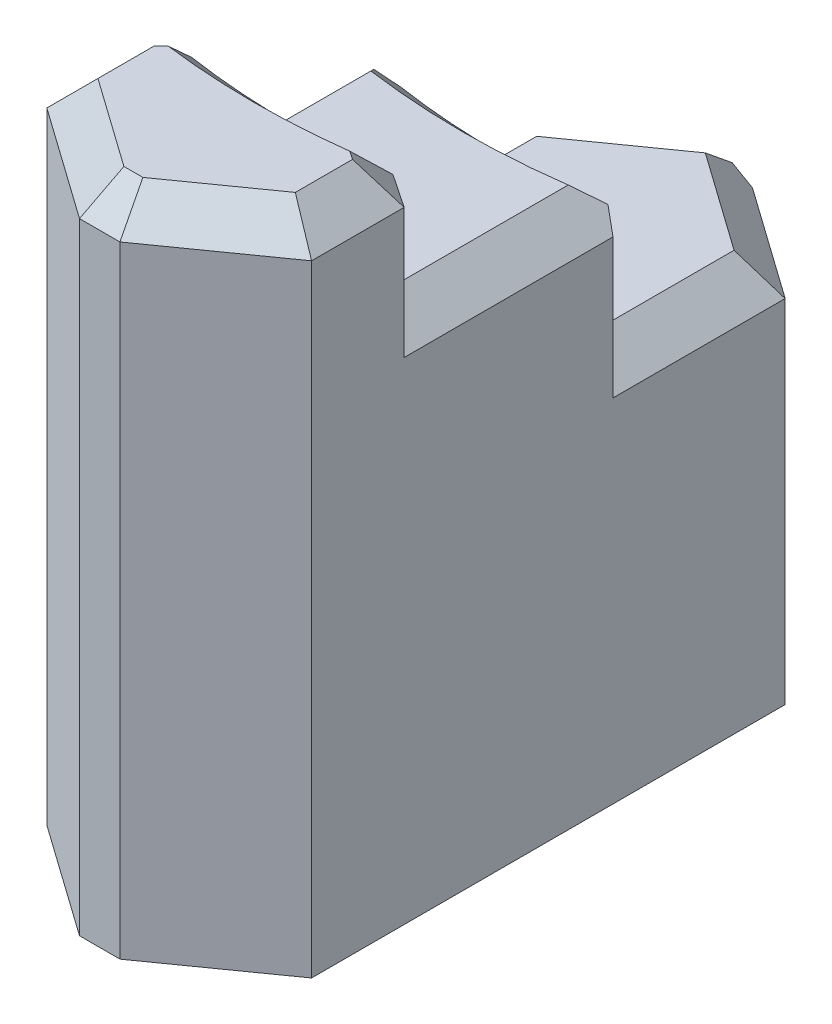
ISO-10303-21;
HEADER;
FILE_DESCRIPTION(('STEP AP214'),'2;1');
FILE_NAME('part.step','',(''),(''),'','','');
FILE_SCHEMA(('AUTOMOTIVE_DESIGN { 1 0 10303 214 1 1 1 1 }'));
ENDSEC;
DATA;
#1=APPLICATION_CONTEXT('core data for automotive mechanical design processes');
#2=APPLICATION_PROTOCOL_DEFINITION('international standard','automotive_design',2000,#1);
#3=PRODUCT_CONTEXT('',#1,'mechanical');
#4=PRODUCT('Part','Part','',(#3));
#5=PRODUCT_RELATED_PRODUCT_CATEGORY('part','',(#4));
#6=PRODUCT_DEFINITION_FORMATION('','',#4);
#7=PRODUCT_DEFINITION_CONTEXT('part definition',#1,'design');
#8=PRODUCT_DEFINITION('design','',#6,#7);
#9=PRODUCT_DEFINITION_SHAPE('','',#8);
#10=(LENGTH_UNIT() NAMED_UNIT(*) SI_UNIT(.MILLI.,.METRE.));
#11=(NAMED_UNIT(*) PLANE_ANGLE_UNIT() SI_UNIT($,.RADIAN.));
#12=(NAMED_UNIT(*) SI_UNIT($,.STERADIAN.) SOLID_ANGLE_UNIT());
#13=UNCERTAINTY_MEASURE_WITH_UNIT(LENGTH_MEASURE(1.E-05),#10,'distance_accuracy_value','');
#14=(GEOMETRIC_REPRESENTATION_CONTEXT(3) GLOBAL_UNCERTAINTY_ASSIGNED_CONTEXT((#13)) GLOBAL_UNIT_ASSIGNED_CONTEXT((#10,
#11,#12)) REPRESENTATION_CONTEXT('',''));
#15=CARTESIAN_POINT('',(0.,0.,0.));
#16=DIRECTION('',(0.,0.,1.));
#17=DIRECTION('',(1.,0.,0.));
#18=AXIS2_PLACEMENT_3D('',#15,#16,#17);
#19=CARTESIAN_POINT('',(9.9822,0.,0.));
#20=DIRECTION('',(0.,0.,-1.));
#21=DIRECTION('',(-1.,0.,0.));
#22=AXIS2_PLACEMENT_3D('',#19,#20,#21);
#23=PLANE('',#22);
#24=DIRECTION('',(0.,1.,0.));
#25=VECTOR('',#24,1.);
#26=CARTESIAN_POINT('',(5.7531,0.,0.));
#27=LINE('',#26,#25);
#28=CARTESIAN_POINT('',(5.7531,0.,0.));
#29=VERTEX_POINT('',#28);
#30=CARTESIAN_POINT('',(5.7531,23.4188,0.));
#31=VERTEX_POINT('',#30);
#32=EDGE_CURVE('E525',#29,#31,#27,.T.);
#33=ORIENTED_EDGE('',*,*,#32,.T.);
#34=DIRECTION('',(-1.,0.,0.));
#35=VECTOR('',#34,1.);
#36=CARTESIAN_POINT('',(9.9822,23.4188,0.));
#37=LINE('',#36,#35);
#38=CARTESIAN_POINT('',(4.2291,23.4188,0.));
#39=VERTEX_POINT('',#38);
#40=EDGE_CURVE('E309',#31,#39,#37,.T.);
#41=ORIENTED_EDGE('',*,*,#40,.T.);
#42=DIRECTION('',(0.,1.,0.));
#43=VECTOR('',#42,1.);
#44=CARTESIAN_POINT('',(4.2291,0.,0.));
#45=LINE('',#44,#43);
#46=CARTESIAN_POINT('',(4.2291,0.,0.));
#47=VERTEX_POINT('',#46);
#48=EDGE_CURVE('E259',#47,#39,#45,.T.);
#49=ORIENTED_EDGE('',*,*,#48,.F.);
#50=DIRECTION('',(-1.,0.,0.));
#51=VECTOR('',#50,1.);
#52=CARTESIAN_POINT('',(9.9822,0.,0.));
#53=LINE('',#52,#51);
#54=EDGE_CURVE('E252',#29,#47,#53,.T.);
#55=ORIENTED_EDGE('',*,*,#54,.F.);
#56=EDGE_LOOP('',(#33,#41,#49,#55));
#57=FACE_BOUND('',#56,.T.);
#58=ADVANCED_FACE('F36',(#57),#23,.F.);
#59=CARTESIAN_POINT('',(9.9822,0.,0.));
#60=DIRECTION('',(0.,1.,0.));
#61=DIRECTION('',(0.,0.,1.));
#62=AXIS2_PLACEMENT_3D('',#59,#60,#61);
#63=PLANE('',#62);
#64=DIRECTION('',(-1.,0.,0.));
#65=VECTOR('',#64,1.);
#66=CARTESIAN_POINT('',(9.9822,0.,-23.8506));
#67=LINE('',#66,#65);
#68=CARTESIAN_POINT('',(5.7531,0.,-23.8506));
#69=VERTEX_POINT('',#68);
#70=CARTESIAN_POINT('',(4.2291,0.,-23.8506));
#71=VERTEX_POINT('',#70);
#72=EDGE_CURVE('E241',#69,#71,#67,.T.);
#73=ORIENTED_EDGE('',*,*,#72,.F.);
#74=DIRECTION('',(0.815879999439261,0.,0.57822126086386));
#75=VECTOR('',#74,1.);
#76=CARTESIAN_POINT('',(5.7531,0.,-23.8506));
#77=LINE('',#76,#75);
#78=CARTESIAN_POINT('',(9.9822,0.,-20.8534));
#79=VERTEX_POINT('',#78);
#80=EDGE_CURVE('E224',#69,#79,#77,.T.);
#81=ORIENTED_EDGE('',*,*,#80,.T.);
#82=DIRECTION('',(0.,0.,-1.));
#83=VECTOR('',#82,1.);
#84=CARTESIAN_POINT('',(9.9822,0.,0.));
#85=LINE('',#84,#83);
#86=CARTESIAN_POINT('',(9.9822,0.,-2.9972));
#87=VERTEX_POINT('',#86);
#88=EDGE_CURVE('E239',#87,#79,#85,.T.);
#89=ORIENTED_EDGE('',*,*,#88,.F.);
#90=DIRECTION('',(-0.81587999943926,0.,0.57822126086386));
#91=VECTOR('',#90,1.);
#92=CARTESIAN_POINT('',(9.9822,0.,-2.9972));
#93=LINE('',#92,#91);
#94=EDGE_CURVE('E514',#87,#29,#93,.T.);
#95=ORIENTED_EDGE('',*,*,#94,.T.);
#96=ORIENTED_EDGE('',*,*,#54,.T.);
#97=DIRECTION('',(-0.81587999943926,0.,-0.57822126086386));
#98=VECTOR('',#97,1.);
#99=CARTESIAN_POINT('',(0.,0.,-2.9972));
#100=LINE('',#99,#98);
#101=CARTESIAN_POINT('',(0.,0.,-2.9972));
#102=VERTEX_POINT('',#101);
#103=EDGE_CURVE('E527',#47,#102,#100,.T.);
#104=ORIENTED_EDGE('',*,*,#103,.T.);
#105=DIRECTION('',(0.,0.,-1.));
#106=VECTOR('',#105,1.);
#107=CARTESIAN_POINT('',(0.,0.,0.));
#108=LINE('',#107,#106);
#109=CARTESIAN_POINT('',(0.,0.,-20.8534));
#110=VERTEX_POINT('',#109);
#111=EDGE_CURVE('E249',#102,#110,#108,.T.);
#112=ORIENTED_EDGE('',*,*,#111,.T.);
#113=DIRECTION('',(0.815879999439261,0.,-0.57822126086386));
#114=VECTOR('',#113,1.);
#115=CARTESIAN_POINT('',(4.2291,0.,-23.8506));
#116=LINE('',#115,#114);
#117=EDGE_CURVE('E517',#110,#71,#116,.T.);
#118=ORIENTED_EDGE('',*,*,#117,.T.);
#119=EDGE_LOOP('',(#73,#81,#89,#95,#96,#104,#112,#118));
#120=FACE_BOUND('',#119,.T.);
#121=ADVANCED_FACE('F237',(#120),#63,.F.);
#122=CARTESIAN_POINT('',(9.9822,0.,-23.8506));
#123=DIRECTION('',(0.,0.,1.));
#124=DIRECTION('',(1.,0.,0.));
#125=AXIS2_PLACEMENT_3D('',#122,#123,#124);
#126=PLANE('',#125);
#127=DIRECTION('',(0.,1.,0.));
#128=VECTOR('',#127,1.);
#129=CARTESIAN_POINT('',(4.2291,0.,-23.8506));
#130=LINE('',#129,#128);
#131=CARTESIAN_POINT('',(4.2291,13.2588,-23.8506));
#132=VERTEX_POINT('',#131);
#133=EDGE_CURVE('E512',#71,#132,#130,.T.);
#134=ORIENTED_EDGE('',*,*,#133,.T.);
#135=DIRECTION('',(-0.865698720476332,-0.500565405682057,0.));
#136=VECTOR('',#135,1.);
#137=CARTESIAN_POINT('',(5.22736411660087,13.8360175361761,-23.8506));
#138=LINE('',#137,#136);
#139=CARTESIAN_POINT('',(4.99110000000001,13.6994046007783,-23.8506));
#140=VERTEX_POINT('',#139);
#141=EDGE_CURVE('E45',#132,#140,#138,.F.);
#142=ORIENTED_EDGE('',*,*,#141,.T.);
#143=DIRECTION('',(-0.865698720476332,0.500565405682056,0.));
#144=VECTOR('',#143,1.);
#145=CARTESIAN_POINT('',(9.73464151590934,10.9565880444891,-23.8506));
#146=LINE('',#145,#144);
#147=CARTESIAN_POINT('',(5.7531,13.2588,-23.8506));
#148=VERTEX_POINT('',#147);
#149=EDGE_CURVE('E488',#140,#148,#146,.F.);
#150=ORIENTED_EDGE('',*,*,#149,.T.);
#151=DIRECTION('',(0.,1.,0.));
#152=VECTOR('',#151,1.);
#153=CARTESIAN_POINT('',(5.7531,0.,-23.8506));
#154=LINE('',#153,#152);
#155=EDGE_CURVE('E232',#69,#148,#154,.T.);
#156=ORIENTED_EDGE('',*,*,#155,.F.);
#157=ORIENTED_EDGE('',*,*,#72,.T.);
#158=EDGE_LOOP('',(#134,#142,#150,#156,#157));
#159=FACE_BOUND('',#158,.T.);
#160=ADVANCED_FACE('F594',(#159),#126,.F.);
#161=CARTESIAN_POINT('',(9.9822,14.5288,-15.4432));
#162=DIRECTION('',(0.,-1.,0.));
#163=DIRECTION('',(0.,0.,-1.));
#164=AXIS2_PLACEMENT_3D('',#161,#162,#163);
#165=PLANE('',#164);
#166=DIRECTION('',(-0.815879999439261,0.,-0.57822126086386));
#167=VECTOR('',#166,1.);
#168=CARTESIAN_POINT('',(11.8001704168978,14.5288,-18.0083870713007));
#169=LINE('',#168,#167);
#170=CARTESIAN_POINT('',(8.71219999999999,14.5288,-20.1968585979911));
#171=VERTEX_POINT('',#170);
#172=CARTESIAN_POINT('',(4.99110000000001,14.5288,-22.834034573967));
#173=VERTEX_POINT('',#172);
#174=EDGE_CURVE('E368',#171,#173,#169,.T.);
#175=ORIENTED_EDGE('',*,*,#174,.T.);
#176=DIRECTION('',(-0.815879999439261,0.,0.57822126086386));
#177=VECTOR('',#176,1.);
#178=CARTESIAN_POINT('',(4.82678256686424,14.5288,-22.7175813781111));
#179=LINE('',#178,#177);
#180=CARTESIAN_POINT('',(1.27,14.5288,-20.1968585979911));
#181=VERTEX_POINT('',#180);
#182=EDGE_CURVE('E497',#173,#181,#179,.T.);
#183=ORIENTED_EDGE('',*,*,#182,.T.);
#184=DIRECTION('',(0.,0.,1.));
#185=VECTOR('',#184,1.);
#186=CARTESIAN_POINT('',(1.27,14.5288,-14.1732));
#187=LINE('',#186,#185);
#188=CARTESIAN_POINT('',(1.27,14.5288,-15.2263209160835));
#189=VERTEX_POINT('',#188);
#190=EDGE_CURVE('E334',#181,#189,#187,.T.);
#191=ORIENTED_EDGE('',*,*,#190,.T.);
#192=CARTESIAN_POINT('',(4.9911,14.5288,-40.8432));
#193=DIRECTION('',(0.,-1.,0.));
#194=DIRECTION('',(0.,0.,-1.));
#195=AXIS2_PLACEMENT_3D('',#192,#193,#194);
#196=CIRCLE('',#195,25.8857311894024);
#197=CARTESIAN_POINT('',(8.69751583986241,14.5288,-15.2241921965737));
#198=VERTEX_POINT('',#197);
#199=EDGE_CURVE('E412',#189,#198,#196,.F.);
#200=ORIENTED_EDGE('',*,*,#199,.T.);
#201=DIRECTION('',(-0.830177549959121,0.,-0.557499090173134));
#202=VECTOR('',#201,1.);
#203=CARTESIAN_POINT('',(9.48155153829823,14.5288,-14.6976792975405));
#204=LINE('',#203,#202);
#205=CARTESIAN_POINT('',(8.71219999999999,14.5288,-15.2143311663434));
#206=VERTEX_POINT('',#205);
#207=EDGE_CURVE('E283',#198,#206,#204,.F.);
#208=ORIENTED_EDGE('',*,*,#207,.T.);
#209=DIRECTION('',(0.,0.,-1.));
#210=VECTOR('',#209,1.);
#211=CARTESIAN_POINT('',(8.71219999999999,14.5288,-15.4432));
#212=LINE('',#211,#210);
#213=EDGE_CURVE('E337',#206,#171,#212,.T.);
#214=ORIENTED_EDGE('',*,*,#213,.T.);
#215=EDGE_LOOP('',(#175,#183,#191,#200,#208,#214));
#216=FACE_BOUND('',#215,.T.);
#217=ADVANCED_FACE('F496',(#216),#165,.F.);
#218=CARTESIAN_POINT('',(9.9822,19.7866,-7.5692));
#219=DIRECTION('',(0.,-1.,0.));
#220=DIRECTION('',(0.,0.,-1.));
#221=AXIS2_PLACEMENT_3D('',#218,#219,#220);
#222=PLANE('',#221);
#223=DIRECTION('',(0.,0.,-1.));
#224=VECTOR('',#223,1.);
#225=CARTESIAN_POINT('',(8.7122,19.7866,-7.5692));
#226=LINE('',#225,#224);
#227=CARTESIAN_POINT('',(8.7122,19.7866,-7.3403311663434));
#228=VERTEX_POINT('',#227);
#229=CARTESIAN_POINT('',(8.7122,19.7866,-13.9436247018455));
#230=VERTEX_POINT('',#229);
#231=EDGE_CURVE('E340',#228,#230,#226,.T.);
#232=ORIENTED_EDGE('',*,*,#231,.T.);
#233=CARTESIAN_POINT('',(4.9911,19.7866,-40.8432));
#234=DIRECTION('',(0.,-1.,0.));
#235=DIRECTION('',(0.,0.,-1.));
#236=AXIS2_PLACEMENT_3D('',#233,#234,#235);
#237=CIRCLE('',#236,27.1557311894024);
#238=CARTESIAN_POINT('',(1.27,19.7866,-13.9436247018455));
#239=VERTEX_POINT('',#238);
#240=EDGE_CURVE('E445',#230,#239,#237,.T.);
#241=ORIENTED_EDGE('',*,*,#240,.T.);
#242=DIRECTION('',(0.,0.,1.));
#243=VECTOR('',#242,1.);
#244=CARTESIAN_POINT('',(1.27,19.7866,-6.29920000000001));
#245=LINE('',#244,#243);
#246=CARTESIAN_POINT('',(1.27,19.7866,-7.35232091608347));
#247=VERTEX_POINT('',#246);
#248=EDGE_CURVE('E343',#239,#247,#245,.T.);
#249=ORIENTED_EDGE('',*,*,#248,.T.);
#250=CARTESIAN_POINT('',(4.9911,19.7866,-32.9692));
#251=DIRECTION('',(0.,-1.,0.));
#252=DIRECTION('',(0.,0.,-1.));
#253=AXIS2_PLACEMENT_3D('',#250,#251,#252);
#254=CIRCLE('',#253,25.8857311894024);
#255=CARTESIAN_POINT('',(8.6975158398624,19.7866,-7.3501921965737));
#256=VERTEX_POINT('',#255);
#257=EDGE_CURVE('E242',#247,#256,#254,.F.);
#258=ORIENTED_EDGE('',*,*,#257,.T.);
#259=DIRECTION('',(-0.830177549959124,0.,-0.557499090173129));
#260=VECTOR('',#259,1.);
#261=CARTESIAN_POINT('',(9.48155153829823,19.7866,-6.82367929754054));
#262=LINE('',#261,#260);
#263=EDGE_CURVE('E286',#256,#228,#262,.F.);
#264=ORIENTED_EDGE('',*,*,#263,.T.);
#265=EDGE_LOOP('',(#232,#241,#249,#258,#264));
#266=FACE_BOUND('',#265,.T.);
#267=ADVANCED_FACE('F603',(#266),#222,.F.);
#268=CARTESIAN_POINT('',(9.9822,24.6888,0.));
#269=DIRECTION('',(0.,-1.,0.));
#270=DIRECTION('',(0.,0.,-1.));
#271=AXIS2_PLACEMENT_3D('',#268,#269,#270);
#272=PLANE('',#271);
#273=DIRECTION('',(1.,0.,0.));
#274=VECTOR('',#273,1.);
#275=CARTESIAN_POINT('',(9.9822,24.6888,-1.27));
#276=LINE('',#275,#274);
#277=CARTESIAN_POINT('',(4.63349952063125,24.6888,-1.27));
#278=VERTEX_POINT('',#277);
#279=CARTESIAN_POINT('',(5.34870047936876,24.6888,-1.27));
#280=VERTEX_POINT('',#279);
#281=EDGE_CURVE('E304',#278,#280,#276,.T.);
#282=ORIENTED_EDGE('',*,*,#281,.T.);
#283=DIRECTION('',(0.815879999439261,0.,-0.57822126086386));
#284=VECTOR('',#283,1.);
#285=CARTESIAN_POINT('',(7.83390243838835,24.6888,-3.03128427125712));
#286=LINE('',#285,#284);
#287=CARTESIAN_POINT('',(8.7122,24.6888,-3.65374140200893));
#288=VERTEX_POINT('',#287);
#289=EDGE_CURVE('E306',#280,#288,#286,.T.);
#290=ORIENTED_EDGE('',*,*,#289,.T.);
#291=DIRECTION('',(0.,0.,-1.));
#292=VECTOR('',#291,1.);
#293=CARTESIAN_POINT('',(8.7122,24.6888,0.));
#294=LINE('',#293,#292);
#295=CARTESIAN_POINT('',(8.7122,24.6888,-5.81053793107399));
#296=VERTEX_POINT('',#295);
#297=EDGE_CURVE('E292',#288,#296,#294,.T.);
#298=ORIENTED_EDGE('',*,*,#297,.T.);
#299=DIRECTION('',(-0.830177549959124,0.,-0.557499090173129));
#300=VECTOR('',#299,1.);
#301=CARTESIAN_POINT('',(7.98949199534252,24.6888,-6.29586670812562));
#302=LINE('',#301,#300);
#303=CARTESIAN_POINT('',(8.38986408936308,24.6888,-6.02700003236673));
#304=VERTEX_POINT('',#303);
#305=EDGE_CURVE('E294',#296,#304,#302,.T.);
#306=ORIENTED_EDGE('',*,*,#305,.T.);
#307=CARTESIAN_POINT('',(4.9911,24.6888,-32.9692));
#308=DIRECTION('',(0.,-1.,0.));
#309=DIRECTION('',(0.,0.,-1.));
#310=AXIS2_PLACEMENT_3D('',#307,#308,#309);
#311=CIRCLE('',#310,27.1557311894024);
#312=CARTESIAN_POINT('',(1.53158464446016,24.6888,-6.03473342024635));
#313=VERTEX_POINT('',#312);
#314=EDGE_CURVE('E296',#304,#313,#311,.T.);
#315=ORIENTED_EDGE('',*,*,#314,.T.);
#316=DIRECTION('',(-0.707106781186546,0.,0.707106781186549));
#317=VECTOR('',#316,1.);
#318=CARTESIAN_POINT('',(0.898025612106918,24.6888,-5.40117438789309));
#319=LINE('',#318,#317);
#320=CARTESIAN_POINT('',(1.27,24.6888,-5.77314877578618));
#321=VERTEX_POINT('',#320);
#322=EDGE_CURVE('E298',#313,#321,#319,.T.);
#323=ORIENTED_EDGE('',*,*,#322,.T.);
#324=DIRECTION('',(0.,0.,1.));
#325=VECTOR('',#324,1.);
#326=CARTESIAN_POINT('',(1.27,24.6888,-2.9972));
#327=LINE('',#326,#325);
#328=CARTESIAN_POINT('',(1.27,24.6888,-3.65374140200893));
#329=VERTEX_POINT('',#328);
#330=EDGE_CURVE('E300',#321,#329,#327,.T.);
#331=ORIENTED_EDGE('',*,*,#330,.T.);
#332=DIRECTION('',(0.81587999943926,0.,0.57822126086386));
#333=VECTOR('',#332,1.);
#334=CARTESIAN_POINT('',(8.7930505453737,24.6888,1.67791003555321));
#335=LINE('',#334,#333);
#336=EDGE_CURVE('E302',#329,#278,#335,.T.);
#337=ORIENTED_EDGE('',*,*,#336,.T.);
#338=EDGE_LOOP('',(#282,#290,#298,#306,#315,#323,#331,#337));
#339=FACE_BOUND('',#338,.T.);
#340=ADVANCED_FACE('F555',(#339),#272,.F.);
#341=CARTESIAN_POINT('',(9.9822,24.6888,0.));
#342=DIRECTION('',(-1.,0.,0.));
#343=DIRECTION('',(0.,0.,1.));
#344=AXIS2_PLACEMENT_3D('',#341,#342,#343);
#345=PLANE('',#344);
#346=DIRECTION('',(0.,1.,0.));
#347=VECTOR('',#346,1.);
#348=CARTESIAN_POINT('',(9.9822,24.6888,-6.48747282952769));
#349=LINE('',#348,#347);
#350=CARTESIAN_POINT('',(9.9822,18.5166,-6.48747282952769));
#351=VERTEX_POINT('',#350);
#352=CARTESIAN_POINT('',(9.9822,23.4188,-6.48747282952769));
#353=VERTEX_POINT('',#352);
#354=EDGE_CURVE('E272',#351,#353,#349,.T.);
#355=ORIENTED_EDGE('',*,*,#354,.T.);
#356=DIRECTION('',(0.,0.,1.));
#357=VECTOR('',#356,1.);
#358=CARTESIAN_POINT('',(9.9822,23.4188,0.));
#359=LINE('',#358,#357);
#360=CARTESIAN_POINT('',(9.9822,23.4188,-2.9972));
#361=VERTEX_POINT('',#360);
#362=EDGE_CURVE('E332',#353,#361,#359,.T.);
#363=ORIENTED_EDGE('',*,*,#362,.T.);
#364=DIRECTION('',(0.,1.,0.));
#365=VECTOR('',#364,1.);
#366=CARTESIAN_POINT('',(9.9822,0.,-2.9972));
#367=LINE('',#366,#365);
#368=EDGE_CURVE('E248',#87,#361,#367,.T.);
#369=ORIENTED_EDGE('',*,*,#368,.F.);
#370=ORIENTED_EDGE('',*,*,#88,.T.);
#371=DIRECTION('',(0.,1.,0.));
#372=VECTOR('',#371,1.);
#373=CARTESIAN_POINT('',(9.9822,0.,-20.8534));
#374=LINE('',#373,#372);
#375=CARTESIAN_POINT('',(9.9822,13.2588,-20.8534));
#376=VERTEX_POINT('',#375);
#377=EDGE_CURVE('E220',#79,#376,#374,.T.);
#378=ORIENTED_EDGE('',*,*,#377,.T.);
#379=DIRECTION('',(0.,0.,1.));
#380=VECTOR('',#379,1.);
#381=CARTESIAN_POINT('',(9.9822,13.2588,0.));
#382=LINE('',#381,#380);
#383=CARTESIAN_POINT('',(9.9822,13.2588,-14.3614728295277));
#384=VERTEX_POINT('',#383);
#385=EDGE_CURVE('E330',#376,#384,#382,.T.);
#386=ORIENTED_EDGE('',*,*,#385,.T.);
#387=DIRECTION('',(0.,1.,0.));
#388=VECTOR('',#387,1.);
#389=CARTESIAN_POINT('',(9.9822,24.6888,-14.3614728295277));
#390=LINE('',#389,#388);
#391=CARTESIAN_POINT('',(9.9822,18.5166,-14.3614728295277));
#392=VERTEX_POINT('',#391);
#393=EDGE_CURVE('E274',#384,#392,#390,.T.);
#394=ORIENTED_EDGE('',*,*,#393,.T.);
#395=DIRECTION('',(0.,0.,1.));
#396=VECTOR('',#395,1.);
#397=CARTESIAN_POINT('',(9.9822,18.5166,0.));
#398=LINE('',#397,#396);
#399=EDGE_CURVE('E327',#392,#351,#398,.T.);
#400=ORIENTED_EDGE('',*,*,#399,.T.);
#401=EDGE_LOOP('',(#355,#363,#369,#370,#378,#386,#394,#400));
#402=FACE_BOUND('',#401,.T.);
#403=ADVANCED_FACE('F246',(#402),#345,.F.);
#404=CARTESIAN_POINT('',(0.,24.6888,0.));
#405=DIRECTION('',(-1.,0.,0.));
#406=DIRECTION('',(0.,0.,1.));
#407=AXIS2_PLACEMENT_3D('',#404,#405,#406);
#408=PLANE('',#407);
#409=DIRECTION('',(0.,1.,0.));
#410=VECTOR('',#409,1.);
#411=CARTESIAN_POINT('',(0.,0.,-2.9972));
#412=LINE('',#411,#410);
#413=CARTESIAN_POINT('',(0.,23.4188,-2.9972));
#414=VERTEX_POINT('',#413);
#415=EDGE_CURVE('E256',#102,#414,#412,.T.);
#416=ORIENTED_EDGE('',*,*,#415,.T.);
#417=DIRECTION('',(0.,0.,-1.));
#418=VECTOR('',#417,1.);
#419=CARTESIAN_POINT('',(0.,23.4188,-6.29920000000001));
#420=LINE('',#419,#418);
#421=CARTESIAN_POINT('',(0.,23.4188,-6.29920000000001));
#422=VERTEX_POINT('',#421);
#423=EDGE_CURVE('E319',#414,#422,#420,.T.);
#424=ORIENTED_EDGE('',*,*,#423,.T.);
#425=DIRECTION('',(0.,-1.,0.));
#426=VECTOR('',#425,1.);
#427=CARTESIAN_POINT('',(0.,19.7866,-6.29920000000001));
#428=LINE('',#427,#426);
#429=CARTESIAN_POINT('',(0.,18.5166,-6.29920000000001));
#430=VERTEX_POINT('',#429);
#431=EDGE_CURVE('E268',#422,#430,#428,.T.);
#432=ORIENTED_EDGE('',*,*,#431,.T.);
#433=DIRECTION('',(0.,0.,-1.));
#434=VECTOR('',#433,1.);
#435=CARTESIAN_POINT('',(0.,18.5166,-14.1732));
#436=LINE('',#435,#434);
#437=CARTESIAN_POINT('',(0.,18.5166,-14.1732));
#438=VERTEX_POINT('',#437);
#439=EDGE_CURVE('E313',#430,#438,#436,.T.);
#440=ORIENTED_EDGE('',*,*,#439,.T.);
#441=DIRECTION('',(0.,-1.,0.));
#442=VECTOR('',#441,1.);
#443=CARTESIAN_POINT('',(0.,14.5288,-14.1732));
#444=LINE('',#443,#442);
#445=CARTESIAN_POINT('',(0.,13.2588,-14.1732));
#446=VERTEX_POINT('',#445);
#447=EDGE_CURVE('E270',#438,#446,#444,.T.);
#448=ORIENTED_EDGE('',*,*,#447,.T.);
#449=DIRECTION('',(0.,0.,-1.));
#450=VECTOR('',#449,1.);
#451=CARTESIAN_POINT('',(0.,13.2588,-20.8534));
#452=LINE('',#451,#450);
#453=CARTESIAN_POINT('',(0.,13.2588,-20.8534));
#454=VERTEX_POINT('',#453);
#455=EDGE_CURVE('E315',#446,#454,#452,.T.);
#456=ORIENTED_EDGE('',*,*,#455,.T.);
#457=DIRECTION('',(0.,1.,0.));
#458=VECTOR('',#457,1.);
#459=CARTESIAN_POINT('',(0.,0.,-20.8534));
#460=LINE('',#459,#458);
#461=EDGE_CURVE('E515',#110,#454,#460,.T.);
#462=ORIENTED_EDGE('',*,*,#461,.F.);
#463=ORIENTED_EDGE('',*,*,#111,.F.);
#464=EDGE_LOOP('',(#416,#424,#432,#440,#448,#456,#462,#463));
#465=FACE_BOUND('',#464,.T.);
#466=ADVANCED_FACE('F578',(#465),#408,.T.);
#467=CARTESIAN_POINT('',(0.,0.,-2.9972));
#468=DIRECTION('',(0.57822126086386,0.,-0.81587999943926));
#469=DIRECTION('',(-0.81587999943926,0.,-0.57822126086386));
#470=AXIS2_PLACEMENT_3D('',#467,#468,#469);
#471=PLANE('',#470);
#472=ORIENTED_EDGE('',*,*,#48,.T.);
#473=DIRECTION('',(-0.81587999943926,0.,-0.57822126086386));
#474=VECTOR('',#473,1.);
#475=CARTESIAN_POINT('',(0.,23.4188,-2.9972));
#476=LINE('',#475,#474);
#477=EDGE_CURVE('E311',#39,#414,#476,.T.);
#478=ORIENTED_EDGE('',*,*,#477,.T.);
#479=ORIENTED_EDGE('',*,*,#415,.F.);
#480=ORIENTED_EDGE('',*,*,#103,.F.);
#481=EDGE_LOOP('',(#472,#478,#479,#480));
#482=FACE_BOUND('',#481,.T.);
#483=ADVANCED_FACE('F540',(#482),#471,.F.);
#484=CARTESIAN_POINT('',(9.9822,0.,-2.9972));
#485=DIRECTION('',(-0.57822126086386,0.,-0.81587999943926));
#486=DIRECTION('',(-0.815879999439261,0.,0.57822126086386));
#487=AXIS2_PLACEMENT_3D('',#484,#485,#486);
#488=PLANE('',#487);
#489=ORIENTED_EDGE('',*,*,#368,.T.);
#490=DIRECTION('',(-0.815879999439261,0.,0.57822126086386));
#491=VECTOR('',#490,1.);
#492=CARTESIAN_POINT('',(9.9822,23.4188,-2.9972));
#493=LINE('',#492,#491);
#494=EDGE_CURVE('E289',#361,#31,#493,.T.);
#495=ORIENTED_EDGE('',*,*,#494,.T.);
#496=ORIENTED_EDGE('',*,*,#32,.F.);
#497=ORIENTED_EDGE('',*,*,#94,.F.);
#498=EDGE_LOOP('',(#489,#495,#496,#497));
#499=FACE_BOUND('',#498,.T.);
#500=ADVANCED_FACE('F610',(#499),#488,.F.);
#501=CARTESIAN_POINT('',(4.2291,0.,-23.8506));
#502=DIRECTION('',(0.57822126086386,0.,0.815879999439261));
#503=DIRECTION('',(0.815879999439261,0.,-0.57822126086386));
#504=AXIS2_PLACEMENT_3D('',#501,#502,#503);
#505=PLANE('',#504);
#506=ORIENTED_EDGE('',*,*,#461,.T.);
#507=DIRECTION('',(0.815879999439261,0.,-0.57822126086386));
#508=VECTOR('',#507,1.);
#509=CARTESIAN_POINT('',(4.2291,13.2588,-23.8506));
#510=LINE('',#509,#508);
#511=EDGE_CURVE('E65',#454,#132,#510,.T.);
#512=ORIENTED_EDGE('',*,*,#511,.T.);
#513=ORIENTED_EDGE('',*,*,#133,.F.);
#514=ORIENTED_EDGE('',*,*,#117,.F.);
#515=EDGE_LOOP('',(#506,#512,#513,#514));
#516=FACE_BOUND('',#515,.T.);
#517=ADVANCED_FACE('F593',(#516),#505,.F.);
#518=CARTESIAN_POINT('',(5.7531,0.,-23.8506));
#519=DIRECTION('',(-0.57822126086386,0.,0.815879999439261));
#520=DIRECTION('',(0.815879999439261,0.,0.57822126086386));
#521=AXIS2_PLACEMENT_3D('',#518,#519,#520);
#522=PLANE('',#521);
#523=ORIENTED_EDGE('',*,*,#155,.T.);
#524=DIRECTION('',(0.815879999439261,0.,0.57822126086386));
#525=VECTOR('',#524,1.);
#526=CARTESIAN_POINT('',(5.7531,13.2588,-23.8506));
#527=LINE('',#526,#525);
#528=EDGE_CURVE('E227',#148,#376,#527,.T.);
#529=ORIENTED_EDGE('',*,*,#528,.T.);
#530=ORIENTED_EDGE('',*,*,#377,.F.);
#531=ORIENTED_EDGE('',*,*,#80,.F.);
#532=EDGE_LOOP('',(#523,#529,#530,#531));
#533=FACE_BOUND('',#532,.T.);
#534=ADVANCED_FACE('F223',(#533),#522,.F.);
#535=CARTESIAN_POINT('',(4.9911,-53.4293042399942,-32.9692));
#536=DIRECTION('',(0.,1.,0.));
#537=DIRECTION('',(0.,0.,1.));
#538=AXIS2_PLACEMENT_3D('',#535,#536,#537);
#539=CYLINDRICAL_SURFACE('',#538,25.8857311894024);
#540=DIRECTION('',(0.,1.,0.));
#541=VECTOR('',#540,1.);
#542=CARTESIAN_POINT('',(1.08124956565735,-53.4293042399942,-7.38044956565736));
#543=LINE('',#542,#541);
#544=CARTESIAN_POINT('',(1.08124956565735,19.5978495656573,-7.38044956565736));
#545=VERTEX_POINT('',#544);
#546=CARTESIAN_POINT('',(1.08124956565735,23.4188,-7.38044956565736));
#547=VERTEX_POINT('',#546);
#548=EDGE_CURVE('E277',#545,#547,#543,.T.);
#549=ORIENTED_EDGE('',*,*,#548,.T.);
#550=CARTESIAN_POINT('',(4.9911,23.4188,-32.9692));
#551=DIRECTION('',(0.,-1.,0.));
#552=DIRECTION('',(0.,0.,-1.));
#553=AXIS2_PLACEMENT_3D('',#550,#551,#552);
#554=CIRCLE('',#553,25.8857311894024);
#555=CARTESIAN_POINT('',(8.6975158398624,23.4188,-7.3501921965737));
#556=VERTEX_POINT('',#555);
#557=EDGE_CURVE('E323',#547,#556,#554,.F.);
#558=ORIENTED_EDGE('',*,*,#557,.T.);
#559=DIRECTION('',(0.,1.,0.));
#560=VECTOR('',#559,1.);
#561=CARTESIAN_POINT('',(8.6975158398624,-53.4293042399942,-7.3501921965737));
#562=LINE('',#561,#560);
#563=EDGE_CURVE('E280',#556,#256,#562,.F.);
#564=ORIENTED_EDGE('',*,*,#563,.T.);
#565=ORIENTED_EDGE('',*,*,#257,.F.);
#566=CARTESIAN_POINT('',(4.9911,23.5077,-32.9692));
#567=DIRECTION('',(-0.707106781186548,0.707106781186547,0.));
#568=DIRECTION('',(0.707106781186547,0.707106781186548,0.));
#569=AXIS2_PLACEMENT_3D('',#566,#567,#568);
#570=ELLIPSE('',#569,36.6079521199972,25.8857311894024);
#571=EDGE_CURVE('E360',#247,#545,#570,.F.);
#572=ORIENTED_EDGE('',*,*,#571,.T.);
#573=EDGE_LOOP('',(#549,#558,#564,#565,#572));
#574=FACE_BOUND('',#573,.T.);
#575=ADVANCED_FACE('F608',(#574),#539,.F.);
#576=CARTESIAN_POINT('',(4.9911,-58.6871042399942,-40.8432));
#577=DIRECTION('',(0.,1.,0.));
#578=DIRECTION('',(0.,0.,1.));
#579=AXIS2_PLACEMENT_3D('',#576,#577,#578);
#580=CYLINDRICAL_SURFACE('',#579,25.8857311894024);
#581=DIRECTION('',(0.,1.,0.));
#582=VECTOR('',#581,1.);
#583=CARTESIAN_POINT('',(1.08124956565735,-58.6871042399942,-15.2544495656574));
#584=LINE('',#583,#582);
#585=CARTESIAN_POINT('',(1.08124956565735,14.3400495656573,-15.2544495656574));
#586=VERTEX_POINT('',#585);
#587=CARTESIAN_POINT('',(1.08124956565735,18.5166,-15.2544495656574));
#588=VERTEX_POINT('',#587);
#589=EDGE_CURVE('E265',#586,#588,#584,.T.);
#590=ORIENTED_EDGE('',*,*,#589,.T.);
#591=CARTESIAN_POINT('',(4.9911,18.5166,-40.8432));
#592=DIRECTION('',(0.,-1.,0.));
#593=DIRECTION('',(0.,0.,-1.));
#594=AXIS2_PLACEMENT_3D('',#591,#592,#593);
#595=CIRCLE('',#594,25.8857311894024);
#596=CARTESIAN_POINT('',(8.69751583986241,18.5166,-15.2241921965737));
#597=VERTEX_POINT('',#596);
#598=EDGE_CURVE('E478',#588,#597,#595,.F.);
#599=ORIENTED_EDGE('',*,*,#598,.T.);
#600=DIRECTION('',(0.,1.,0.));
#601=VECTOR('',#600,1.);
#602=CARTESIAN_POINT('',(8.69751583986241,-58.6871042399942,-15.2241921965737));
#603=LINE('',#602,#601);
#604=EDGE_CURVE('E263',#597,#198,#603,.F.);
#605=ORIENTED_EDGE('',*,*,#604,.T.);
#606=ORIENTED_EDGE('',*,*,#199,.F.);
#607=CARTESIAN_POINT('',(4.9911,18.2499,-40.8432));
#608=DIRECTION('',(-0.707106781186548,0.707106781186547,0.));
#609=DIRECTION('',(0.707106781186547,0.707106781186548,0.));
#610=AXIS2_PLACEMENT_3D('',#607,#608,#609);
#611=ELLIPSE('',#610,36.6079521199972,25.8857311894024);
#612=EDGE_CURVE('E352',#189,#586,#611,.F.);
#613=ORIENTED_EDGE('',*,*,#612,.T.);
#614=EDGE_LOOP('',(#590,#599,#605,#606,#613));
#615=FACE_BOUND('',#614,.T.);
#616=ADVANCED_FACE('F621',(#615),#580,.F.);
#617=CARTESIAN_POINT('',(1.08124956565735,-58.6871042399942,-15.2544495656574));
#618=DIRECTION('',(0.707106781186549,0.,0.707106781186546));
#619=DIRECTION('',(0.707106781186546,0.,-0.707106781186549));
#620=AXIS2_PLACEMENT_3D('',#617,#618,#619);
#621=PLANE('',#620);
#622=DIRECTION('',(-0.577350269189624,-0.577350269189626,0.577350269189627));
#623=VECTOR('',#622,1.);
#624=CARTESIAN_POINT('',(-25.0137350362264,-6.49713503622652,10.8405350362266));
#625=LINE('',#624,#623);
#626=CARTESIAN_POINT('',(0.577463280485097,19.0940632804851,-14.7506632804851));
#627=VERTEX_POINT('',#626);
#628=EDGE_CURVE('E345',#438,#627,#625,.F.);
#629=ORIENTED_EDGE('',*,*,#628,.T.);
#630=CARTESIAN_POINT('',(0.577463280485097,19.0940632804851,-14.7506632804851));
#631=CARTESIAN_POINT('',(0.661235891761203,18.9974848012851,-14.8344358917612));
#632=CARTESIAN_POINT('',(0.745104386908851,18.9010736226948,-14.9183043869089));
#633=CARTESIAN_POINT('',(0.913033148624535,18.7085858625184,-15.0862331486245));
#634=CARTESIAN_POINT('',(0.997093415200969,18.612509280947,-15.170293415201));
#635=CARTESIAN_POINT('',(1.08124956565734,18.5166,-15.2544495656574));
#636=B_SPLINE_CURVE_WITH_KNOTS('',3,(#630,#631,#632,#633,#634,#635),.UNSPECIFIED.,.F.,.F.,(4,2,
4),(0.,0.458548447630694,0.917096915343979),.UNSPECIFIED.);
#637=EDGE_CURVE('E444',#627,#588,#636,.T.);
#638=ORIENTED_EDGE('',*,*,#637,.T.);
#639=ORIENTED_EDGE('',*,*,#589,.F.);
#640=DIRECTION('',(0.577350269189624,0.577350269189626,-0.577350269189627));
#641=VECTOR('',#640,1.);
#642=CARTESIAN_POINT('',(1.27,14.5288,-15.4432));
#643=LINE('',#642,#641);
#644=EDGE_CURVE('E356',#586,#446,#643,.F.);
#645=ORIENTED_EDGE('',*,*,#644,.T.);
#646=ORIENTED_EDGE('',*,*,#447,.F.);
#647=EDGE_LOOP('',(#629,#638,#639,#645,#646));
#648=FACE_BOUND('',#647,.T.);
#649=ADVANCED_FACE('F587',(#648),#621,.F.);
#650=CARTESIAN_POINT('',(9.9822,-58.6871042399942,-14.3614728295277));
#651=DIRECTION('',(-0.557499090173134,0.,0.83017754995912));
#652=DIRECTION('',(0.83017754995912,0.,0.557499090173134));
#653=AXIS2_PLACEMENT_3D('',#650,#651,#652);
#654=PLANE('',#653);
#655=ORIENTED_EDGE('',*,*,#604,.F.);
#656=CARTESIAN_POINT('',(8.69751583986241,18.5166,-15.2241921965737));
#657=CARTESIAN_POINT('',(8.8157392096836,18.6121205330907,-15.1448002386537));
#658=CARTESIAN_POINT('',(8.93372309426424,18.7080656239254,-15.0655691051304));
#659=CARTESIAN_POINT('',(9.16921186963608,18.9008049020061,-14.9074285025301));
#660=CARTESIAN_POINT('',(9.28671676052209,18.9975990890839,-14.8285190333894));
#661=CARTESIAN_POINT('',(9.40398216626236,19.0948178337376,-14.7497703885818));
#662=B_SPLINE_CURVE_WITH_KNOTS('',3,(#656,#657,#658,#659,#660,#661),.UNSPECIFIED.,.F.,.F.,(4,2,
4),(0.,0.514421101781996,1.02884210173083),.UNSPECIFIED.);
#663=CARTESIAN_POINT('',(9.40398216626236,19.0948178337377,-14.7497703885818));
#664=VERTEX_POINT('',#663);
#665=EDGE_CURVE('E461',#597,#664,#662,.T.);
#666=ORIENTED_EDGE('',*,*,#665,.T.);
#667=DIRECTION('',(0.638750306398286,-0.638750306398284,0.428947656657772));
#668=VECTOR('',#667,1.);
#669=CARTESIAN_POINT('',(41.4814621800808,-12.9826621800807,6.79160461442964));
#670=LINE('',#669,#668);
#671=EDGE_CURVE('E348',#664,#392,#670,.T.);
#672=ORIENTED_EDGE('',*,*,#671,.T.);
#673=ORIENTED_EDGE('',*,*,#393,.F.);
#674=DIRECTION('',(-0.638750306398287,0.638750306398283,-0.428947656657772));
#675=VECTOR('',#674,1.);
#676=CARTESIAN_POINT('',(13.9171063618494,9.32389363815066,-11.7190179513447));
#677=LINE('',#676,#675);
#678=EDGE_CURVE('E350',#384,#206,#677,.T.);
#679=ORIENTED_EDGE('',*,*,#678,.T.);
#680=ORIENTED_EDGE('',*,*,#207,.F.);
#681=EDGE_LOOP('',(#655,#666,#672,#673,#679,#680));
#682=FACE_BOUND('',#681,.T.);
#683=ADVANCED_FACE('F620',(#682),#654,.F.);
#684=CARTESIAN_POINT('',(9.9822,-53.4293042399942,-6.48747282952769));
#685=DIRECTION('',(-0.557499090173129,0.,0.830177549959124));
#686=DIRECTION('',(0.830177549959124,0.,0.557499090173129));
#687=AXIS2_PLACEMENT_3D('',#684,#685,#686);
#688=PLANE('',#687);
#689=ORIENTED_EDGE('',*,*,#563,.F.);
#690=DIRECTION('',(-0.830177549959124,0.,-0.557499090173129));
#691=VECTOR('',#690,1.);
#692=CARTESIAN_POINT('',(9.9822,23.4188,-6.48747282952769));
#693=LINE('',#692,#691);
#694=EDGE_CURVE('E325',#556,#353,#693,.F.);
#695=ORIENTED_EDGE('',*,*,#694,.T.);
#696=ORIENTED_EDGE('',*,*,#354,.F.);
#697=DIRECTION('',(-0.638750306398287,0.638750306398286,-0.428947656657768));
#698=VECTOR('',#697,1.);
#699=CARTESIAN_POINT('',(11.7597055812345,16.7390944187655,-5.29380318095109));
#700=LINE('',#699,#698);
#701=EDGE_CURVE('E366',#351,#228,#700,.T.);
#702=ORIENTED_EDGE('',*,*,#701,.T.);
#703=ORIENTED_EDGE('',*,*,#263,.F.);
#704=EDGE_LOOP('',(#689,#695,#696,#702,#703));
#705=FACE_BOUND('',#704,.T.);
#706=ADVANCED_FACE('F601',(#705),#688,.F.);
#707=CARTESIAN_POINT('',(1.08124956565735,-53.4293042399942,-7.38044956565736));
#708=DIRECTION('',(0.707106781186549,0.,0.707106781186546));
#709=DIRECTION('',(0.707106781186546,0.,-0.707106781186549));
#710=AXIS2_PLACEMENT_3D('',#707,#708,#709);
#711=PLANE('',#710);
#712=ORIENTED_EDGE('',*,*,#431,.F.);
#713=DIRECTION('',(-0.707106781186546,0.,0.707106781186549));
#714=VECTOR('',#713,1.);
#715=CARTESIAN_POINT('',(1.08124956565734,23.4188,-7.38044956565736));
#716=LINE('',#715,#714);
#717=EDGE_CURVE('E321',#422,#547,#716,.F.);
#718=ORIENTED_EDGE('',*,*,#717,.T.);
#719=ORIENTED_EDGE('',*,*,#548,.F.);
#720=DIRECTION('',(0.577350269189624,0.577350269189626,-0.577350269189627));
#721=VECTOR('',#720,1.);
#722=CARTESIAN_POINT('',(1.27,19.7866,-7.56920000000001));
#723=LINE('',#722,#721);
#724=EDGE_CURVE('E363',#545,#430,#723,.F.);
#725=ORIENTED_EDGE('',*,*,#724,.T.);
#726=EDGE_LOOP('',(#712,#718,#719,#725));
#727=FACE_BOUND('',#726,.T.);
#728=ADVANCED_FACE('F417',(#727),#711,.F.);
#729=CARTESIAN_POINT('',(2.73952561210689,24.6888,-7.24267438789307));
#730=DIRECTION('',(0.5,-0.707106781186549,0.499999999999998));
#731=DIRECTION('',(0.816496580927726,0.577350269189625,0.));
#732=AXIS2_PLACEMENT_3D('',#729,#730,#731);
#733=PLANE('',#732);
#734=DIRECTION('',(-0.678598344545848,-0.678598344545846,-0.28108463771482));
#735=VECTOR('',#734,1.);
#736=CARTESIAN_POINT('',(1.66640768363207,25.0852076836321,-5.60895133699687));
#737=LINE('',#736,#735);
#738=EDGE_CURVE('E391',#321,#422,#737,.T.);
#739=ORIENTED_EDGE('',*,*,#738,.F.);
#740=ORIENTED_EDGE('',*,*,#322,.F.);
#741=CARTESIAN_POINT('',(1.08124956565735,23.4188,-7.38044956565736));
#742=CARTESIAN_POINT('',(1.15506597518336,23.6301169523908,-7.15541867515297));
#743=CARTESIAN_POINT('',(1.2295021081974,23.8416087758625,-6.93076020308227));
#744=CARTESIAN_POINT('',(1.37961380145772,24.2649421092879,-6.48218815480787));
#745=CARTESIAN_POINT('',(1.45528936137794,24.4767836191495,-6.25827457840823));
#746=CARTESIAN_POINT('',(1.53158464446016,24.6888,-6.03473342024634));
#747=B_SPLINE_CURVE_WITH_KNOTS('',3,(#741,#742,#743,#744,#745,#746),.UNSPECIFIED.,.F.,.F.,(4,2,
4),(0.,0.952191485626512,1.90438272077406),.UNSPECIFIED.);
#748=EDGE_CURVE('E405',#547,#313,#747,.T.);
#749=ORIENTED_EDGE('',*,*,#748,.F.);
#750=ORIENTED_EDGE('',*,*,#717,.F.);
#751=EDGE_LOOP('',(#739,#740,#749,#750));
#752=FACE_BOUND('',#751,.T.);
#753=ADVANCED_FACE('F401',(#752),#733,.F.);
#754=CARTESIAN_POINT('',(4.9911,23.4188,-32.9692));
#755=DIRECTION('',(0.,1.,0.));
#756=DIRECTION('',(0.,0.,1.));
#757=AXIS2_PLACEMENT_3D('',#754,#755,#756);
#758=CONICAL_SURFACE('',#757,25.8857311894024,0.78539816339745);
#759=ORIENTED_EDGE('',*,*,#748,.T.);
#760=ORIENTED_EDGE('',*,*,#314,.F.);
#761=CARTESIAN_POINT('',(8.6975158398624,23.4188,-7.3501921965737));
#762=CARTESIAN_POINT('',(8.6472019592467,23.6302716612743,-7.12924943726033));
#763=CARTESIAN_POINT('',(8.59640737122307,23.8418408327109,-6.90851203616256));
#764=CARTESIAN_POINT('',(8.49385678758778,24.2651741660717,-6.46744798148479));
#765=CARTESIAN_POINT('',(8.44210079211164,24.4769383279685,-6.24712132784691));
#766=CARTESIAN_POINT('',(8.38986408936309,24.6888,-6.02700003236673));
#767=B_SPLINE_CURVE_WITH_KNOTS('',3,(#761,#762,#763,#764,#765,#766),.UNSPECIFIED.,.F.,.F.,(4,2,
4),(0.,0.929838395886234,1.85967666070083),.UNSPECIFIED.);
#768=EDGE_CURVE('E382',#556,#304,#767,.T.);
#769=ORIENTED_EDGE('',*,*,#768,.F.);
#770=ORIENTED_EDGE('',*,*,#557,.F.);
#771=EDGE_LOOP('',(#759,#760,#769,#770));
#772=FACE_BOUND('',#771,.T.);
#773=ADVANCED_FACE('F396',(#772),#758,.F.);
#774=CARTESIAN_POINT('',(1.27,24.6888,0.));
#775=DIRECTION('',(-0.707106781186546,0.707106781186548,0.));
#776=DIRECTION('',(-0.707106781186549,-0.707106781186547,0.));
#777=AXIS2_PLACEMENT_3D('',#774,#775,#776);
#778=PLANE('',#777);
#779=ORIENTED_EDGE('',*,*,#738,.T.);
#780=ORIENTED_EDGE('',*,*,#423,.F.);
#781=DIRECTION('',(-0.664125795155427,-0.664125795155425,0.343327622568221));
#782=VECTOR('',#781,1.);
#783=CARTESIAN_POINT('',(0.436900446982817,23.8557004469828,-3.22306081259876));
#784=LINE('',#783,#782);
#785=EDGE_CURVE('E379',#329,#414,#784,.T.);
#786=ORIENTED_EDGE('',*,*,#785,.F.);
#787=ORIENTED_EDGE('',*,*,#330,.F.);
#788=EDGE_LOOP('',(#779,#780,#786,#787));
#789=FACE_BOUND('',#788,.T.);
#790=ADVANCED_FACE('F400',(#789),#778,.T.);
#791=CARTESIAN_POINT('',(12.276729277093,24.6888,-3.41680682021381));
#792=DIRECTION('',(-0.39421138716675,-0.707106781186549,0.587024175164929));
#793=DIRECTION('',(0.,-0.638750306398285,-0.769414092719971));
#794=AXIS2_PLACEMENT_3D('',#791,#792,#793);
#795=PLANE('',#794);
#796=ORIENTED_EDGE('',*,*,#768,.T.);
#797=ORIENTED_EDGE('',*,*,#305,.F.);
#798=DIRECTION('',(-0.66167008793742,0.661670087937418,0.35268312896675));
#799=VECTOR('',#798,1.);
#800=CARTESIAN_POINT('',(8.46828413873646,24.9327158612635,-5.68052599503014));
#801=LINE('',#800,#799);
#802=EDGE_CURVE('E376',#353,#296,#801,.T.);
#803=ORIENTED_EDGE('',*,*,#802,.F.);
#804=ORIENTED_EDGE('',*,*,#694,.F.);
#805=EDGE_LOOP('',(#796,#797,#803,#804));
#806=FACE_BOUND('',#805,.T.);
#807=ADVANCED_FACE('F393',(#806),#795,.F.);
#808=CARTESIAN_POINT('',(0.,23.4188,-2.9972));
#809=DIRECTION('',(0.408864174583071,-0.707106781186549,-0.576914280237976));
#810=DIRECTION('',(0.,0.632168840981757,-0.774830663107612));
#811=AXIS2_PLACEMENT_3D('',#808,#809,#810);
#812=PLANE('',#811);
#813=ORIENTED_EDGE('',*,*,#785,.T.);
#814=ORIENTED_EDGE('',*,*,#477,.F.);
#815=DIRECTION('',(0.219661087523158,0.689836577251504,-0.689836577251506));
#816=VECTOR('',#815,1.);
#817=CARTESIAN_POINT('',(4.47920819754027,24.2042544693335,-0.785454469333526));
#818=LINE('',#817,#816);
#819=EDGE_CURVE('E373',#278,#39,#818,.F.);
#820=ORIENTED_EDGE('',*,*,#819,.F.);
#821=ORIENTED_EDGE('',*,*,#336,.F.);
#822=EDGE_LOOP('',(#813,#814,#820,#821));
#823=FACE_BOUND('',#822,.T.);
#824=ADVANCED_FACE('F545',(#823),#812,.F.);
#825=CARTESIAN_POINT('',(9.9822,23.4188,0.));
#826=DIRECTION('',(-0.707106781186546,-0.707106781186548,0.));
#827=DIRECTION('',(0.707106781186549,-0.707106781186547,0.));
#828=AXIS2_PLACEMENT_3D('',#825,#826,#827);
#829=PLANE('',#828);
#830=ORIENTED_EDGE('',*,*,#802,.T.);
#831=ORIENTED_EDGE('',*,*,#297,.F.);
#832=DIRECTION('',(0.664125795155427,-0.664125795155425,0.34332762256822));
#833=VECTOR('',#832,1.);
#834=CARTESIAN_POINT('',(10.6655997553659,22.7354002446341,-2.64390847754293));
#835=LINE('',#834,#833);
#836=EDGE_CURVE('E371',#361,#288,#835,.F.);
#837=ORIENTED_EDGE('',*,*,#836,.F.);
#838=ORIENTED_EDGE('',*,*,#362,.F.);
#839=EDGE_LOOP('',(#830,#831,#837,#838));
#840=FACE_BOUND('',#839,.T.);
#841=ADVANCED_FACE('F562',(#840),#829,.F.);
#842=CARTESIAN_POINT('',(9.9822,23.4188,0.));
#843=DIRECTION('',(0.,-0.707106781186548,-0.707106781186547));
#844=DIRECTION('',(0.,0.707106781186547,-0.707106781186548));
#845=AXIS2_PLACEMENT_3D('',#842,#843,#844);
#846=PLANE('',#845);
#847=ORIENTED_EDGE('',*,*,#819,.T.);
#848=ORIENTED_EDGE('',*,*,#40,.F.);
#849=DIRECTION('',(-0.219661087523156,0.689836577251505,-0.689836577251506));
#850=VECTOR('',#849,1.);
#851=CARTESIAN_POINT('',(5.95715827606892,22.7779634080006,0.640836591999407));
#852=LINE('',#851,#850);
#853=EDGE_CURVE('E369',#280,#31,#852,.F.);
#854=ORIENTED_EDGE('',*,*,#853,.F.);
#855=ORIENTED_EDGE('',*,*,#281,.F.);
#856=EDGE_LOOP('',(#847,#848,#854,#855));
#857=FACE_BOUND('',#856,.T.);
#858=ADVANCED_FACE('F551',(#857),#846,.F.);
#859=CARTESIAN_POINT('',(9.9822,23.4188,-2.9972));
#860=DIRECTION('',(-0.408864174583071,-0.707106781186548,-0.576914280237977));
#861=DIRECTION('',(0.,0.632168840981758,-0.774830663107611));
#862=AXIS2_PLACEMENT_3D('',#859,#860,#861);
#863=PLANE('',#862);
#864=ORIENTED_EDGE('',*,*,#836,.T.);
#865=ORIENTED_EDGE('',*,*,#289,.F.);
#866=ORIENTED_EDGE('',*,*,#853,.T.);
#867=ORIENTED_EDGE('',*,*,#494,.F.);
#868=EDGE_LOOP('',(#864,#865,#866,#867));
#869=FACE_BOUND('',#868,.T.);
#870=ADVANCED_FACE('F423',(#869),#863,.F.);
#871=CARTESIAN_POINT('',(9.9822,13.2588,0.));
#872=DIRECTION('',(-0.707106781186546,-0.70710678118655,0.));
#873=DIRECTION('',(0.70710678118655,-0.707106781186546,0.));
#874=AXIS2_PLACEMENT_3D('',#871,#872,#873);
#875=PLANE('',#874);
#876=ORIENTED_EDGE('',*,*,#385,.F.);
#877=DIRECTION('',(-0.664125795155429,0.664125795155425,0.343327622568216));
#878=VECTOR('',#877,1.);
#879=CARTESIAN_POINT('',(5.22735932919167,18.0136406708083,-18.3953293225657));
#880=LINE('',#879,#878);
#881=EDGE_CURVE('E482',#376,#171,#880,.T.);
#882=ORIENTED_EDGE('',*,*,#881,.T.);
#883=ORIENTED_EDGE('',*,*,#213,.F.);
#884=ORIENTED_EDGE('',*,*,#678,.F.);
#885=EDGE_LOOP('',(#876,#882,#883,#884));
#886=FACE_BOUND('',#885,.T.);
#887=ADVANCED_FACE('F419',(#886),#875,.F.);
#888=CARTESIAN_POINT('',(1.27,14.5288,-15.4432));
#889=DIRECTION('',(-0.707106781186548,0.707106781186547,0.));
#890=DIRECTION('',(-0.707106781186547,-0.707106781186548,0.));
#891=AXIS2_PLACEMENT_3D('',#888,#889,#890);
#892=PLANE('',#891);
#893=ORIENTED_EDGE('',*,*,#190,.F.);
#894=DIRECTION('',(0.664125795155426,0.664125795155427,0.343327622568219));
#895=VECTOR('',#894,1.);
#896=CARTESIAN_POINT('',(2.35389467601761,15.6126946760176,-19.6365265269496));
#897=LINE('',#896,#895);
#898=EDGE_CURVE('E504',#181,#454,#897,.F.);
#899=ORIENTED_EDGE('',*,*,#898,.T.);
#900=ORIENTED_EDGE('',*,*,#455,.F.);
#901=ORIENTED_EDGE('',*,*,#644,.F.);
#902=ORIENTED_EDGE('',*,*,#612,.F.);
#903=EDGE_LOOP('',(#893,#899,#900,#901,#902));
#904=FACE_BOUND('',#903,.T.);
#905=ADVANCED_FACE('F422',(#904),#892,.T.);
#906=CARTESIAN_POINT('',(1.27,19.7866,-7.5692));
#907=DIRECTION('',(-0.707106781186548,0.707106781186547,0.));
#908=DIRECTION('',(-0.707106781186547,-0.707106781186548,0.));
#909=AXIS2_PLACEMENT_3D('',#906,#907,#908);
#910=PLANE('',#909);
#911=ORIENTED_EDGE('',*,*,#248,.F.);
#912=CARTESIAN_POINT('',(1.27,19.7866,-13.9436247018455));
#913=CARTESIAN_POINT('',(1.15386637010613,19.6704663701061,-14.0769110925342));
#914=CARTESIAN_POINT('',(1.03808817221308,19.5546881722131,-14.2108074905229));
#915=CARTESIAN_POINT('',(0.807242598784973,19.323842598785,-14.4798203496292));
#916=CARTESIAN_POINT('',(0.692175223506387,19.2087752235064,-14.6149368111871));
#917=CARTESIAN_POINT('',(0.577463280485092,19.0940632804851,-14.7506632804851));
#918=B_SPLINE_CURVE_WITH_KNOTS('',3,(#912,#913,#914,#915,#916,#917),.UNSPECIFIED.,.F.,.F.,(4,2,
4),(0.,0.634536719569194,1.26907366807435),.UNSPECIFIED.);
#919=EDGE_CURVE('E437',#239,#627,#918,.T.);
#920=ORIENTED_EDGE('',*,*,#919,.T.);
#921=ORIENTED_EDGE('',*,*,#628,.F.);
#922=ORIENTED_EDGE('',*,*,#439,.F.);
#923=ORIENTED_EDGE('',*,*,#724,.F.);
#924=ORIENTED_EDGE('',*,*,#571,.F.);
#925=EDGE_LOOP('',(#911,#920,#921,#922,#923,#924));
#926=FACE_BOUND('',#925,.T.);
#927=ADVANCED_FACE('F427',(#926),#910,.T.);
#928=CARTESIAN_POINT('',(9.9822,18.5166,0.));
#929=DIRECTION('',(-0.707106781186546,-0.707106781186548,0.));
#930=DIRECTION('',(0.707106781186549,-0.707106781186547,0.));
#931=AXIS2_PLACEMENT_3D('',#928,#929,#930);
#932=PLANE('',#931);
#933=ORIENTED_EDGE('',*,*,#671,.F.);
#934=CARTESIAN_POINT('',(9.40398216626236,19.0948178337377,-14.7497703885818));
#935=CARTESIAN_POINT('',(9.2893943959018,19.2094056040982,-14.614195436685));
#936=CARTESIAN_POINT('',(9.17445198643787,19.3243480135621,-14.4792291415399));
#937=CARTESIAN_POINT('',(8.94385793076203,19.554942069238,-14.2105139130655));
#938=CARTESIAN_POINT('',(8.82820628480518,19.6705937151948,-14.0767649792986));
#939=CARTESIAN_POINT('',(8.7122,19.7866,-13.9436247018455));
#940=B_SPLINE_CURVE_WITH_KNOTS('',3,(#934,#935,#936,#937,#938,#939),.UNSPECIFIED.,.F.,.F.,(4,2,
4),(0.,0.63384125954971,1.2676822911812),.UNSPECIFIED.);
#941=EDGE_CURVE('E469',#664,#230,#940,.T.);
#942=ORIENTED_EDGE('',*,*,#941,.T.);
#943=ORIENTED_EDGE('',*,*,#231,.F.);
#944=ORIENTED_EDGE('',*,*,#701,.F.);
#945=ORIENTED_EDGE('',*,*,#399,.F.);
#946=EDGE_LOOP('',(#933,#942,#943,#944,#945));
#947=FACE_BOUND('',#946,.T.);
#948=ADVANCED_FACE('F432',(#947),#932,.F.);
#949=CARTESIAN_POINT('',(11.8001704168978,14.5288,-18.0083870713007));
#950=DIRECTION('',(-0.408864174583071,-0.707106781186547,0.576914280237978));
#951=DIRECTION('',(0.,-0.63216884098176,-0.77483066310761));
#952=AXIS2_PLACEMENT_3D('',#949,#950,#951);
#953=PLANE('',#952);
#954=ORIENTED_EDGE('',*,*,#149,.F.);
#955=DIRECTION('',(0.,0.63216884098176,0.77483066310761));
#956=VECTOR('',#955,1.);
#957=CARTESIAN_POINT('',(4.9911,16.8925170080929,-19.9368965025381));
#958=LINE('',#957,#956);
#959=EDGE_CURVE('E11',#140,#173,#958,.T.);
#960=ORIENTED_EDGE('',*,*,#959,.T.);
#961=ORIENTED_EDGE('',*,*,#174,.F.);
#962=ORIENTED_EDGE('',*,*,#881,.F.);
#963=ORIENTED_EDGE('',*,*,#528,.F.);
#964=EDGE_LOOP('',(#954,#960,#961,#962,#963));
#965=FACE_BOUND('',#964,.T.);
#966=ADVANCED_FACE('F456',(#965),#953,.F.);
#967=CARTESIAN_POINT('',(4.9911,18.5166,-40.8432));
#968=DIRECTION('',(0.,1.,0.));
#969=DIRECTION('',(0.,0.,1.));
#970=AXIS2_PLACEMENT_3D('',#967,#968,#969);
#971=CONICAL_SURFACE('',#970,25.8857311894024,0.785398163397444);
#972=ORIENTED_EDGE('',*,*,#919,.F.);
#973=ORIENTED_EDGE('',*,*,#240,.F.);
#974=ORIENTED_EDGE('',*,*,#941,.F.);
#975=ORIENTED_EDGE('',*,*,#665,.F.);
#976=ORIENTED_EDGE('',*,*,#598,.F.);
#977=ORIENTED_EDGE('',*,*,#637,.F.);
#978=EDGE_LOOP('',(#972,#973,#974,#975,#976,#977));
#979=FACE_BOUND('',#978,.T.);
#980=ADVANCED_FACE('F453',(#979),#971,.F.);
#981=CARTESIAN_POINT('',(4.82678256686424,14.5288,-22.7175813781111));
#982=DIRECTION('',(0.408864174583072,-0.707106781186546,0.576914280237979));
#983=DIRECTION('',(0.,-0.63216884098176,-0.774830663107609));
#984=AXIS2_PLACEMENT_3D('',#981,#982,#983);
#985=PLANE('',#984);
#986=ORIENTED_EDGE('',*,*,#141,.F.);
#987=ORIENTED_EDGE('',*,*,#511,.F.);
#988=ORIENTED_EDGE('',*,*,#898,.F.);
#989=ORIENTED_EDGE('',*,*,#182,.F.);
#990=ORIENTED_EDGE('',*,*,#959,.F.);
#991=EDGE_LOOP('',(#986,#987,#988,#989,#990));
#992=FACE_BOUND('',#991,.T.);
#993=ADVANCED_FACE('F38',(#992),#985,.F.);
#994=CLOSED_SHELL('',(#58,#121,#160,#217,#267,#340,#403,#466,#483,#500,#517,#534,#575,#616,#649,
#683,#706,#728,#753,#773,#790,#807,#824,#841,#858,#870,#887,#905,#927,#948,#966,#980,#993));
#995=MANIFOLD_SOLID_BREP('B2',#994);
#996=ADVANCED_BREP_SHAPE_REPRESENTATION('',(#18,#995),#14);
#997=SHAPE_DEFINITION_REPRESENTATION(#9,#996);
ENDSEC;
END-ISO-10303-21;
